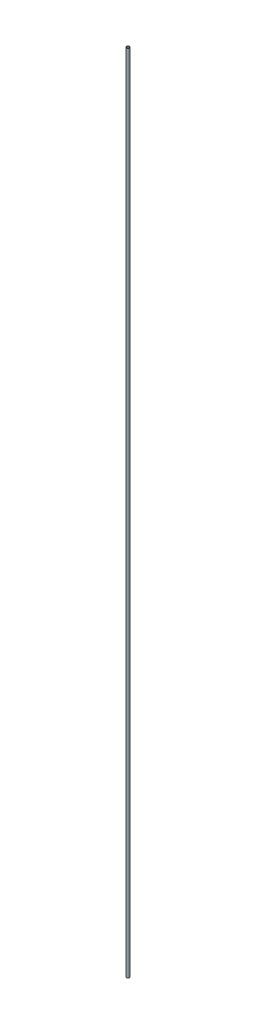
ISO-10303-21;
HEADER;
FILE_DESCRIPTION(('STEP AP214'),'2;1');
FILE_NAME('part.step','',(''),(''),'','','');
FILE_SCHEMA(('AUTOMOTIVE_DESIGN { 1 0 10303 214 1 1 1 1 }'));
ENDSEC;
DATA;
#1=APPLICATION_CONTEXT('core data for automotive mechanical design processes');
#2=APPLICATION_PROTOCOL_DEFINITION('international standard','automotive_design',2000,#1);
#3=PRODUCT_CONTEXT('',#1,'mechanical');
#4=PRODUCT('Part','Part','',(#3));
#5=PRODUCT_RELATED_PRODUCT_CATEGORY('part','',(#4));
#6=PRODUCT_DEFINITION_FORMATION('','',#4);
#7=PRODUCT_DEFINITION_CONTEXT('part definition',#1,'design');
#8=PRODUCT_DEFINITION('design','',#6,#7);
#9=PRODUCT_DEFINITION_SHAPE('','',#8);
#10=(LENGTH_UNIT() NAMED_UNIT(*) SI_UNIT(.MILLI.,.METRE.));
#11=(NAMED_UNIT(*) PLANE_ANGLE_UNIT() SI_UNIT($,.RADIAN.));
#12=(NAMED_UNIT(*) SI_UNIT($,.STERADIAN.) SOLID_ANGLE_UNIT());
#13=UNCERTAINTY_MEASURE_WITH_UNIT(LENGTH_MEASURE(1.E-05),#10,'distance_accuracy_value','');
#14=(GEOMETRIC_REPRESENTATION_CONTEXT(3) GLOBAL_UNCERTAINTY_ASSIGNED_CONTEXT((#13)) GLOBAL_UNIT_ASSIGNED_CONTEXT((#10,
#11,#12)) REPRESENTATION_CONTEXT('',''));
#15=CARTESIAN_POINT('',(0.,0.,0.));
#16=DIRECTION('',(0.,0.,1.));
#17=DIRECTION('',(1.,0.,0.));
#18=AXIS2_PLACEMENT_3D('',#15,#16,#17);
#19=CARTESIAN_POINT('',(0.,800.,0.));
#20=DIRECTION('',(0.,1.,0.));
#21=DIRECTION('',(0.,0.,1.));
#22=AXIS2_PLACEMENT_3D('',#19,#20,#21);
#23=PLANE('',#22);
#24=CARTESIAN_POINT('',(0.,800.,0.));
#25=DIRECTION('',(0.,1.,0.));
#26=DIRECTION('',(0.,0.,1.));
#27=AXIS2_PLACEMENT_3D('',#24,#25,#26);
#28=CIRCLE('',#27,1.5);
#29=CARTESIAN_POINT('',(0.,800.,1.5));
#30=VERTEX_POINT('',#29);
#31=EDGE_CURVE('E10',#30,#30,#28,.T.);
#32=ORIENTED_EDGE('',*,*,#31,.T.);
#33=EDGE_LOOP('',(#32));
#34=FACE_BOUND('',#33,.T.);
#35=CARTESIAN_POINT('',(0.,800.,0.));
#36=DIRECTION('',(0.,1.,0.));
#37=DIRECTION('',(0.,0.,1.));
#38=AXIS2_PLACEMENT_3D('',#35,#36,#37);
#39=CIRCLE('',#38,1.25);
#40=CARTESIAN_POINT('',(0.,800.,1.25));
#41=VERTEX_POINT('',#40);
#42=EDGE_CURVE('E52',#41,#41,#39,.T.);
#43=ORIENTED_EDGE('',*,*,#42,.F.);
#44=EDGE_LOOP('',(#43));
#45=FACE_BOUND('',#44,.T.);
#46=ADVANCED_FACE('F41',(#34,#45),#23,.T.);
#47=CARTESIAN_POINT('',(0.,0.,0.));
#48=DIRECTION('',(0.,1.,0.));
#49=DIRECTION('',(0.,0.,1.));
#50=AXIS2_PLACEMENT_3D('',#47,#48,#49);
#51=PLANE('',#50);
#52=CARTESIAN_POINT('',(0.,0.,0.));
#53=DIRECTION('',(0.,1.,0.));
#54=DIRECTION('',(0.,0.,1.));
#55=AXIS2_PLACEMENT_3D('',#52,#53,#54);
#56=CIRCLE('',#55,1.5);
#57=CARTESIAN_POINT('',(0.,0.,1.5));
#58=VERTEX_POINT('',#57);
#59=EDGE_CURVE('E45',#58,#58,#56,.T.);
#60=ORIENTED_EDGE('',*,*,#59,.F.);
#61=EDGE_LOOP('',(#60));
#62=FACE_BOUND('',#61,.T.);
#63=CARTESIAN_POINT('',(0.,0.,0.));
#64=DIRECTION('',(0.,1.,0.));
#65=DIRECTION('',(0.,0.,1.));
#66=AXIS2_PLACEMENT_3D('',#63,#64,#65);
#67=CIRCLE('',#66,1.25);
#68=CARTESIAN_POINT('',(0.,0.,1.25));
#69=VERTEX_POINT('',#68);
#70=EDGE_CURVE('E54',#69,#69,#67,.T.);
#71=ORIENTED_EDGE('',*,*,#70,.T.);
#72=EDGE_LOOP('',(#71));
#73=FACE_BOUND('',#72,.T.);
#74=ADVANCED_FACE('F64',(#62,#73),#51,.F.);
#75=CARTESIAN_POINT('',(0.,800.,0.));
#76=DIRECTION('',(0.,-1.,0.));
#77=DIRECTION('',(0.,0.,-1.));
#78=AXIS2_PLACEMENT_3D('',#75,#76,#77);
#79=CYLINDRICAL_SURFACE('',#78,1.5);
#80=ORIENTED_EDGE('',*,*,#31,.F.);
#81=EDGE_LOOP('',(#80));
#82=FACE_BOUND('',#81,.T.);
#83=ORIENTED_EDGE('',*,*,#59,.T.);
#84=EDGE_LOOP('',(#83));
#85=FACE_BOUND('',#84,.T.);
#86=ADVANCED_FACE('F43',(#82,#85),#79,.T.);
#87=CARTESIAN_POINT('',(0.,800.,0.));
#88=DIRECTION('',(0.,-1.,0.));
#89=DIRECTION('',(0.,0.,-1.));
#90=AXIS2_PLACEMENT_3D('',#87,#88,#89);
#91=CYLINDRICAL_SURFACE('',#90,1.25);
#92=ORIENTED_EDGE('',*,*,#42,.T.);
#93=EDGE_LOOP('',(#92));
#94=FACE_BOUND('',#93,.T.);
#95=ORIENTED_EDGE('',*,*,#70,.F.);
#96=EDGE_LOOP('',(#95));
#97=FACE_BOUND('',#96,.T.);
#98=ADVANCED_FACE('F60',(#94,#97),#91,.F.);
#99=CLOSED_SHELL('',(#46,#74,#86,#98));
#100=MANIFOLD_SOLID_BREP('B2',#99);
#101=ADVANCED_BREP_SHAPE_REPRESENTATION('',(#18,#100),#14);
#102=SHAPE_DEFINITION_REPRESENTATION(#9,#101);
ENDSEC;
END-ISO-10303-21;
